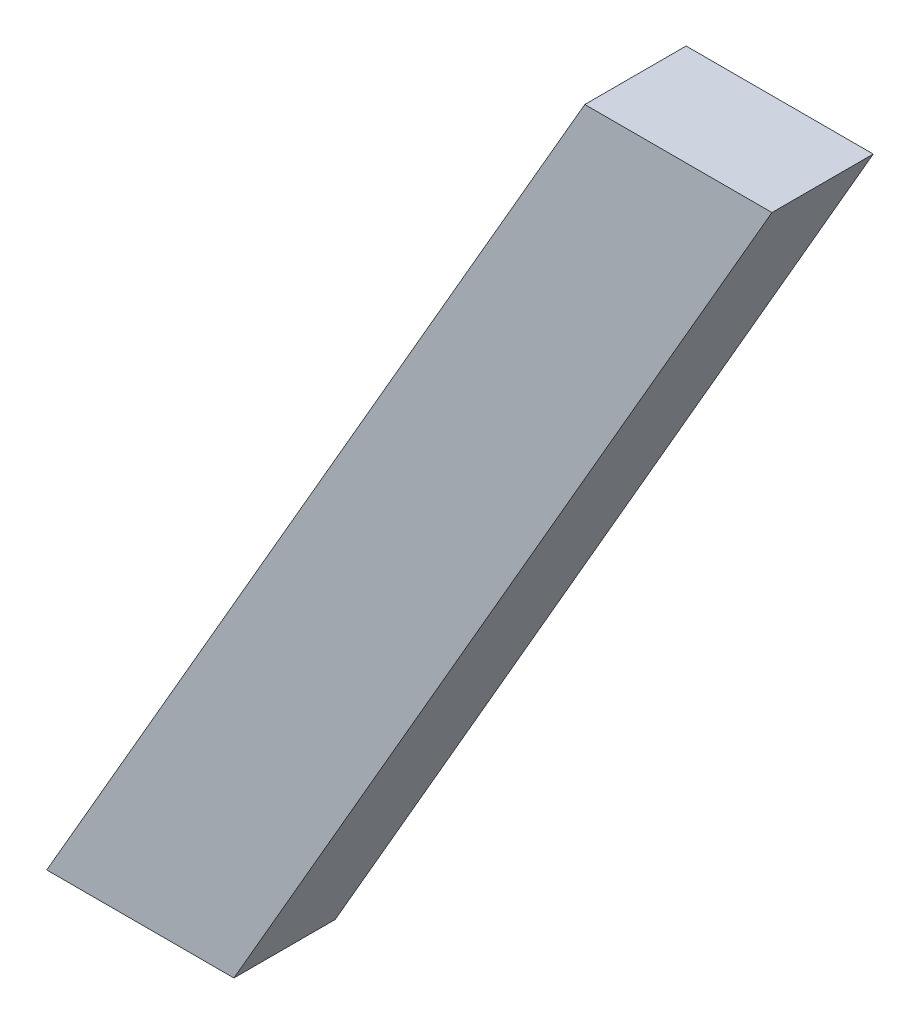
ISO-10303-21;
HEADER;
FILE_DESCRIPTION(('STEP AP214'),'2;1');
FILE_NAME('part.step','',(''),(''),'','','');
FILE_SCHEMA(('AUTOMOTIVE_DESIGN { 1 0 10303 214 1 1 1 1 }'));
ENDSEC;
DATA;
#1=APPLICATION_CONTEXT('core data for automotive mechanical design processes');
#2=APPLICATION_PROTOCOL_DEFINITION('international standard','automotive_design',2000,#1);
#3=PRODUCT_CONTEXT('',#1,'mechanical');
#4=PRODUCT('Part','Part','',(#3));
#5=PRODUCT_RELATED_PRODUCT_CATEGORY('part','',(#4));
#6=PRODUCT_DEFINITION_FORMATION('','',#4);
#7=PRODUCT_DEFINITION_CONTEXT('part definition',#1,'design');
#8=PRODUCT_DEFINITION('design','',#6,#7);
#9=PRODUCT_DEFINITION_SHAPE('','',#8);
#10=(LENGTH_UNIT() NAMED_UNIT(*) SI_UNIT(.MILLI.,.METRE.));
#11=(NAMED_UNIT(*) PLANE_ANGLE_UNIT() SI_UNIT($,.RADIAN.));
#12=(NAMED_UNIT(*) SI_UNIT($,.STERADIAN.) SOLID_ANGLE_UNIT());
#13=UNCERTAINTY_MEASURE_WITH_UNIT(LENGTH_MEASURE(1.E-05),#10,'distance_accuracy_value','');
#14=(GEOMETRIC_REPRESENTATION_CONTEXT(3) GLOBAL_UNCERTAINTY_ASSIGNED_CONTEXT((#13)) GLOBAL_UNIT_ASSIGNED_CONTEXT((#10,
#11,#12)) REPRESENTATION_CONTEXT('',''));
#15=CARTESIAN_POINT('',(0.,0.,0.));
#16=DIRECTION('',(0.,0.,1.));
#17=DIRECTION('',(1.,0.,0.));
#18=AXIS2_PLACEMENT_3D('',#15,#16,#17);
#19=CARTESIAN_POINT('',(132.790561913615,230.,25.));
#20=DIRECTION('',(0.866025403784436,-0.500000000000004,0.));
#21=DIRECTION('',(0.500000000000004,0.866025403784436,0.));
#22=AXIS2_PLACEMENT_3D('',#19,#20,#21);
#23=PLANE('',#22);
#24=DIRECTION('',(-0.500000000000004,-0.866025403784436,0.));
#25=VECTOR('',#24,1.);
#26=CARTESIAN_POINT('',(132.790561913615,230.,0.));
#27=LINE('',#26,#25);
#28=CARTESIAN_POINT('',(132.790561913615,230.,0.));
#29=VERTEX_POINT('',#28);
#30=CARTESIAN_POINT('',(0.,0.,0.));
#31=VERTEX_POINT('',#30);
#32=EDGE_CURVE('E96',#29,#31,#27,.T.);
#33=ORIENTED_EDGE('',*,*,#32,.T.);
#34=DIRECTION('',(0.,0.,-1.));
#35=VECTOR('',#34,1.);
#36=CARTESIAN_POINT('',(0.,0.,25.));
#37=LINE('',#36,#35);
#38=CARTESIAN_POINT('',(0.,0.,25.));
#39=VERTEX_POINT('',#38);
#40=EDGE_CURVE('E11',#39,#31,#37,.T.);
#41=ORIENTED_EDGE('',*,*,#40,.F.);
#42=DIRECTION('',(-0.500000000000004,-0.866025403784436,0.));
#43=VECTOR('',#42,1.);
#44=CARTESIAN_POINT('',(132.790561913615,230.,25.));
#45=LINE('',#44,#43);
#46=CARTESIAN_POINT('',(132.790561913615,230.,25.));
#47=VERTEX_POINT('',#46);
#48=EDGE_CURVE('E84',#47,#39,#45,.T.);
#49=ORIENTED_EDGE('',*,*,#48,.F.);
#50=DIRECTION('',(0.,0.,-1.));
#51=VECTOR('',#50,1.);
#52=CARTESIAN_POINT('',(132.790561913615,230.,25.));
#53=LINE('',#52,#51);
#54=EDGE_CURVE('E92',#47,#29,#53,.T.);
#55=ORIENTED_EDGE('',*,*,#54,.T.);
#56=EDGE_LOOP('',(#33,#41,#49,#55));
#57=FACE_BOUND('',#56,.T.);
#58=ADVANCED_FACE('F33',(#57),#23,.F.);
#59=CARTESIAN_POINT('',(0.,0.,25.));
#60=DIRECTION('',(0.,1.,0.));
#61=DIRECTION('',(0.,0.,1.));
#62=AXIS2_PLACEMENT_3D('',#59,#60,#61);
#63=PLANE('',#62);
#64=DIRECTION('',(1.,0.,0.));
#65=VECTOR('',#64,1.);
#66=CARTESIAN_POINT('',(0.,0.,0.));
#67=LINE('',#66,#65);
#68=CARTESIAN_POINT('',(46.1880215351702,0.,0.));
#69=VERTEX_POINT('',#68);
#70=EDGE_CURVE('E88',#31,#69,#67,.T.);
#71=ORIENTED_EDGE('',*,*,#70,.T.);
#72=DIRECTION('',(0.,0.,-1.));
#73=VECTOR('',#72,1.);
#74=CARTESIAN_POINT('',(46.1880215351702,0.,25.));
#75=LINE('',#74,#73);
#76=CARTESIAN_POINT('',(46.1880215351702,0.,25.));
#77=VERTEX_POINT('',#76);
#78=EDGE_CURVE('E41',#77,#69,#75,.T.);
#79=ORIENTED_EDGE('',*,*,#78,.F.);
#80=DIRECTION('',(1.,0.,0.));
#81=VECTOR('',#80,1.);
#82=CARTESIAN_POINT('',(0.,0.,25.));
#83=LINE('',#82,#81);
#84=EDGE_CURVE('E79',#39,#77,#83,.T.);
#85=ORIENTED_EDGE('',*,*,#84,.F.);
#86=ORIENTED_EDGE('',*,*,#40,.T.);
#87=EDGE_LOOP('',(#71,#79,#85,#86));
#88=FACE_BOUND('',#87,.T.);
#89=ADVANCED_FACE('F87',(#88),#63,.F.);
#90=CARTESIAN_POINT('',(46.1880215351702,0.,25.));
#91=DIRECTION('',(-0.866025403784436,0.500000000000004,0.));
#92=DIRECTION('',(-0.500000000000004,-0.866025403784436,0.));
#93=AXIS2_PLACEMENT_3D('',#90,#91,#92);
#94=PLANE('',#93);
#95=DIRECTION('',(0.500000000000004,0.866025403784436,0.));
#96=VECTOR('',#95,1.);
#97=CARTESIAN_POINT('',(46.1880215351702,0.,0.));
#98=LINE('',#97,#96);
#99=CARTESIAN_POINT('',(178.978583448785,230.,0.));
#100=VERTEX_POINT('',#99);
#101=EDGE_CURVE('E66',#69,#100,#98,.T.);
#102=ORIENTED_EDGE('',*,*,#101,.T.);
#103=DIRECTION('',(0.,0.,-1.));
#104=VECTOR('',#103,1.);
#105=CARTESIAN_POINT('',(178.978583448785,230.,25.));
#106=LINE('',#105,#104);
#107=CARTESIAN_POINT('',(178.978583448785,230.,25.));
#108=VERTEX_POINT('',#107);
#109=EDGE_CURVE('E89',#108,#100,#106,.T.);
#110=ORIENTED_EDGE('',*,*,#109,.F.);
#111=DIRECTION('',(0.500000000000004,0.866025403784436,0.));
#112=VECTOR('',#111,1.);
#113=CARTESIAN_POINT('',(46.1880215351702,0.,25.));
#114=LINE('',#113,#112);
#115=EDGE_CURVE('E82',#77,#108,#114,.T.);
#116=ORIENTED_EDGE('',*,*,#115,.F.);
#117=ORIENTED_EDGE('',*,*,#78,.T.);
#118=EDGE_LOOP('',(#102,#110,#116,#117));
#119=FACE_BOUND('',#118,.T.);
#120=ADVANCED_FACE('F90',(#119),#94,.F.);
#121=CARTESIAN_POINT('',(178.978583448785,230.,25.));
#122=DIRECTION('',(0.,-1.,0.));
#123=DIRECTION('',(1.,0.,0.));
#124=AXIS2_PLACEMENT_3D('',#121,#122,#123);
#125=PLANE('',#124);
#126=DIRECTION('',(-1.,0.,0.));
#127=VECTOR('',#126,1.);
#128=CARTESIAN_POINT('',(178.978583448785,230.,0.));
#129=LINE('',#128,#127);
#130=EDGE_CURVE('E72',#100,#29,#129,.T.);
#131=ORIENTED_EDGE('',*,*,#130,.T.);
#132=ORIENTED_EDGE('',*,*,#54,.F.);
#133=DIRECTION('',(-1.,0.,0.));
#134=VECTOR('',#133,1.);
#135=CARTESIAN_POINT('',(178.978583448785,230.,25.));
#136=LINE('',#135,#134);
#137=EDGE_CURVE('E49',#108,#47,#136,.T.);
#138=ORIENTED_EDGE('',*,*,#137,.F.);
#139=ORIENTED_EDGE('',*,*,#109,.T.);
#140=EDGE_LOOP('',(#131,#132,#138,#139));
#141=FACE_BOUND('',#140,.T.);
#142=ADVANCED_FACE('F103',(#141),#125,.F.);
#143=CARTESIAN_POINT('',(0.,0.,25.));
#144=DIRECTION('',(0.,0.,1.));
#145=DIRECTION('',(1.,0.,0.));
#146=AXIS2_PLACEMENT_3D('',#143,#144,#145);
#147=PLANE('',#146);
#148=ORIENTED_EDGE('',*,*,#48,.T.);
#149=ORIENTED_EDGE('',*,*,#84,.T.);
#150=ORIENTED_EDGE('',*,*,#115,.T.);
#151=ORIENTED_EDGE('',*,*,#137,.T.);
#152=EDGE_LOOP('',(#148,#149,#150,#151));
#153=FACE_BOUND('',#152,.T.);
#154=ADVANCED_FACE('F80',(#153),#147,.T.);
#155=CARTESIAN_POINT('',(0.,0.,0.));
#156=DIRECTION('',(0.,0.,1.));
#157=DIRECTION('',(1.,0.,0.));
#158=AXIS2_PLACEMENT_3D('',#155,#156,#157);
#159=PLANE('',#158);
#160=ORIENTED_EDGE('',*,*,#32,.F.);
#161=ORIENTED_EDGE('',*,*,#130,.F.);
#162=ORIENTED_EDGE('',*,*,#101,.F.);
#163=ORIENTED_EDGE('',*,*,#70,.F.);
#164=EDGE_LOOP('',(#160,#161,#162,#163));
#165=FACE_BOUND('',#164,.T.);
#166=ADVANCED_FACE('F106',(#165),#159,.F.);
#167=CLOSED_SHELL('',(#58,#89,#120,#142,#154,#166));
#168=MANIFOLD_SOLID_BREP('B2',#167);
#169=ADVANCED_BREP_SHAPE_REPRESENTATION('',(#18,#168),#14);
#170=SHAPE_DEFINITION_REPRESENTATION(#9,#169);
ENDSEC;
END-ISO-10303-21;
